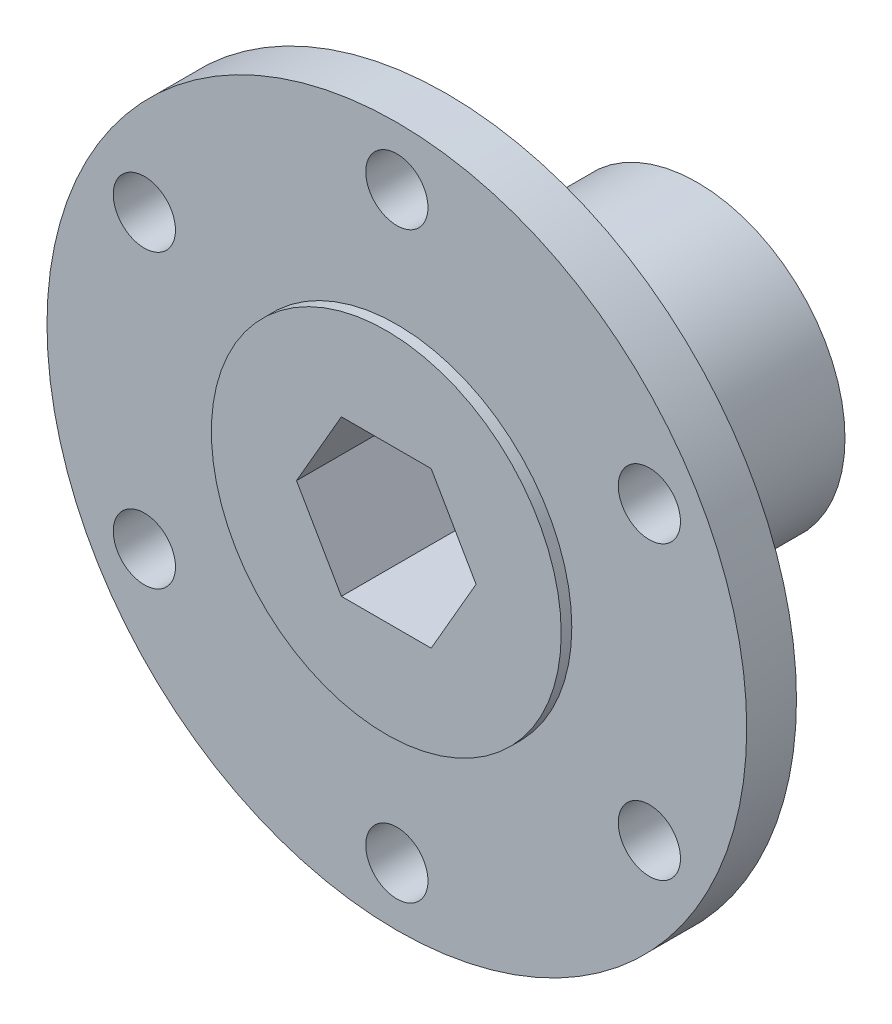
ISO-10303-21;
HEADER;
FILE_DESCRIPTION(('STEP AP214'),'2;1');
FILE_NAME('part.step','',(''),(''),'','','');
FILE_SCHEMA(('AUTOMOTIVE_DESIGN { 1 0 10303 214 1 1 1 1 }'));
ENDSEC;
DATA;
#1=APPLICATION_CONTEXT('core data for automotive mechanical design processes');
#2=APPLICATION_PROTOCOL_DEFINITION('international standard','automotive_design',2000,#1);
#3=PRODUCT_CONTEXT('',#1,'mechanical');
#4=PRODUCT('Part','Part','',(#3));
#5=PRODUCT_RELATED_PRODUCT_CATEGORY('part','',(#4));
#6=PRODUCT_DEFINITION_FORMATION('','',#4);
#7=PRODUCT_DEFINITION_CONTEXT('part definition',#1,'design');
#8=PRODUCT_DEFINITION('design','',#6,#7);
#9=PRODUCT_DEFINITION_SHAPE('','',#8);
#10=(LENGTH_UNIT() NAMED_UNIT(*) SI_UNIT(.MILLI.,.METRE.));
#11=(NAMED_UNIT(*) PLANE_ANGLE_UNIT() SI_UNIT($,.RADIAN.));
#12=(NAMED_UNIT(*) SI_UNIT($,.STERADIAN.) SOLID_ANGLE_UNIT());
#13=UNCERTAINTY_MEASURE_WITH_UNIT(LENGTH_MEASURE(1.E-05),#10,'distance_accuracy_value','');
#14=(GEOMETRIC_REPRESENTATION_CONTEXT(3) GLOBAL_UNCERTAINTY_ASSIGNED_CONTEXT((#13)) GLOBAL_UNIT_ASSIGNED_CONTEXT((#10,
#11,#12)) REPRESENTATION_CONTEXT('',''));
#15=CARTESIAN_POINT('',(0.,0.,0.));
#16=DIRECTION('',(0.,0.,1.));
#17=DIRECTION('',(1.,0.,0.));
#18=AXIS2_PLACEMENT_3D('',#15,#16,#17);
#19=CARTESIAN_POINT('',(0.,0.,0.));
#20=DIRECTION('',(0.,0.,1.));
#21=DIRECTION('',(1.,0.,0.));
#22=AXIS2_PLACEMENT_3D('',#19,#20,#21);
#23=PLANE('',#22);
#24=CARTESIAN_POINT('',(-20.6222299276163,11.9062499999988,0.));
#25=DIRECTION('',(0.,0.,1.));
#26=DIRECTION('',(1.,0.,0.));
#27=AXIS2_PLACEMENT_3D('',#24,#25,#26);
#28=CIRCLE('',#27,2.54000000000127);
#29=CARTESIAN_POINT('',(-18.082229927615,11.9062499999988,0.));
#30=VERTEX_POINT('',#29);
#31=EDGE_CURVE('E135',#30,#30,#28,.T.);
#32=ORIENTED_EDGE('',*,*,#31,.T.);
#33=EDGE_LOOP('',(#32));
#34=FACE_BOUND('',#33,.T.);
#35=CARTESIAN_POINT('',(-20.6222299276149,-11.9062500000012,0.));
#36=DIRECTION('',(0.,0.,1.));
#37=DIRECTION('',(1.,0.,0.));
#38=AXIS2_PLACEMENT_3D('',#35,#36,#37);
#39=CIRCLE('',#38,2.5400000000025);
#40=CARTESIAN_POINT('',(-18.0822299276124,-11.9062500000012,0.));
#41=VERTEX_POINT('',#40);
#42=EDGE_CURVE('E141',#41,#41,#39,.T.);
#43=ORIENTED_EDGE('',*,*,#42,.T.);
#44=EDGE_LOOP('',(#43));
#45=FACE_BOUND('',#44,.T.);
#46=CARTESIAN_POINT('',(2.70133544286504E-12,-23.8125,0.));
#47=DIRECTION('',(0.,0.,1.));
#48=DIRECTION('',(1.,0.,0.));
#49=AXIS2_PLACEMENT_3D('',#46,#47,#48);
#50=CIRCLE('',#49,2.54000000000274);
#51=CARTESIAN_POINT('',(2.54000000000544,-23.8125,0.));
#52=VERTEX_POINT('',#51);
#53=EDGE_CURVE('E147',#52,#52,#50,.T.);
#54=ORIENTED_EDGE('',*,*,#53,.T.);
#55=EDGE_LOOP('',(#54));
#56=FACE_BOUND('',#55,.T.);
#57=CARTESIAN_POINT('',(20.622229927619,-11.9062499999988,0.));
#58=DIRECTION('',(0.,0.,1.));
#59=DIRECTION('',(1.,0.,0.));
#60=AXIS2_PLACEMENT_3D('',#57,#58,#59);
#61=CIRCLE('',#60,2.5400000000017);
#62=CARTESIAN_POINT('',(23.1622299276207,-11.9062499999988,0.));
#63=VERTEX_POINT('',#62);
#64=EDGE_CURVE('E153',#63,#63,#61,.T.);
#65=ORIENTED_EDGE('',*,*,#64,.T.);
#66=EDGE_LOOP('',(#65));
#67=FACE_BOUND('',#66,.T.);
#68=CARTESIAN_POINT('',(20.6222299276176,11.9062500000012,0.));
#69=DIRECTION('',(0.,0.,1.));
#70=DIRECTION('',(1.,0.,0.));
#71=AXIS2_PLACEMENT_3D('',#68,#69,#70);
#72=CIRCLE('',#71,2.54000000000037);
#73=CARTESIAN_POINT('',(23.162229927618,11.9062500000012,0.));
#74=VERTEX_POINT('',#73);
#75=EDGE_CURVE('E159',#74,#74,#72,.T.);
#76=ORIENTED_EDGE('',*,*,#75,.T.);
#77=EDGE_LOOP('',(#76));
#78=FACE_BOUND('',#77,.T.);
#79=CARTESIAN_POINT('',(0.,0.,0.));
#80=DIRECTION('',(0.,0.,1.));
#81=DIRECTION('',(1.,0.,0.));
#82=AXIS2_PLACEMENT_3D('',#79,#80,#81);
#83=CIRCLE('',#82,28.575);
#84=CARTESIAN_POINT('',(28.575,0.,0.));
#85=VERTEX_POINT('',#84);
#86=EDGE_CURVE('E179',#85,#85,#83,.T.);
#87=ORIENTED_EDGE('',*,*,#86,.F.);
#88=EDGE_LOOP('',(#87));
#89=FACE_BOUND('',#88,.T.);
#90=CARTESIAN_POINT('',(0.,23.8125,0.));
#91=DIRECTION('',(0.,0.,1.));
#92=DIRECTION('',(1.,0.,0.));
#93=AXIS2_PLACEMENT_3D('',#90,#91,#92);
#94=CIRCLE('',#93,2.54);
#95=CARTESIAN_POINT('',(2.54,23.8125,0.));
#96=VERTEX_POINT('',#95);
#97=EDGE_CURVE('E175',#96,#96,#94,.T.);
#98=ORIENTED_EDGE('',*,*,#97,.T.);
#99=EDGE_LOOP('',(#98));
#100=FACE_BOUND('',#99,.T.);
#101=CARTESIAN_POINT('',(0.,0.,0.));
#102=DIRECTION('',(0.,0.,1.));
#103=DIRECTION('',(1.,0.,0.));
#104=AXIS2_PLACEMENT_3D('',#101,#102,#103);
#105=CIRCLE('',#104,12.065);
#106=CARTESIAN_POINT('',(12.065,0.,0.));
#107=VERTEX_POINT('',#106);
#108=EDGE_CURVE('E11',#107,#107,#105,.F.);
#109=ORIENTED_EDGE('',*,*,#108,.F.);
#110=EDGE_LOOP('',(#109));
#111=FACE_BOUND('',#110,.T.);
#112=ADVANCED_FACE('F32',(#34,#45,#56,#67,#78,#89,#100,#111),#23,.F.);
#113=CARTESIAN_POINT('',(0.,0.,4.064));
#114=DIRECTION('',(0.,0.,1.));
#115=DIRECTION('',(1.,0.,0.));
#116=AXIS2_PLACEMENT_3D('',#113,#114,#115);
#117=PLANE('',#116);
#118=CARTESIAN_POINT('',(0.,0.,4.064));
#119=DIRECTION('',(0.,0.,1.));
#120=DIRECTION('',(1.,0.,0.));
#121=AXIS2_PLACEMENT_3D('',#118,#119,#120);
#122=CIRCLE('',#121,14.2875);
#123=CARTESIAN_POINT('',(14.2875,0.,4.064));
#124=VERTEX_POINT('',#123);
#125=EDGE_CURVE('E116',#124,#124,#122,.T.);
#126=ORIENTED_EDGE('',*,*,#125,.F.);
#127=EDGE_LOOP('',(#126));
#128=FACE_BOUND('',#127,.T.);
#129=CARTESIAN_POINT('',(-20.6222299276149,-11.9062500000012,4.064));
#130=DIRECTION('',(0.,0.,1.));
#131=DIRECTION('',(1.,0.,0.));
#132=AXIS2_PLACEMENT_3D('',#129,#130,#131);
#133=CIRCLE('',#132,2.5400000000025);
#134=CARTESIAN_POINT('',(-18.0822299276124,-11.9062500000012,4.064));
#135=VERTEX_POINT('',#134);
#136=EDGE_CURVE('E144',#135,#135,#133,.T.);
#137=ORIENTED_EDGE('',*,*,#136,.F.);
#138=EDGE_LOOP('',(#137));
#139=FACE_BOUND('',#138,.T.);
#140=CARTESIAN_POINT('',(20.622229927619,-11.9062499999988,4.064));
#141=DIRECTION('',(0.,0.,1.));
#142=DIRECTION('',(1.,0.,0.));
#143=AXIS2_PLACEMENT_3D('',#140,#141,#142);
#144=CIRCLE('',#143,2.5400000000017);
#145=CARTESIAN_POINT('',(23.1622299276207,-11.9062499999988,4.064));
#146=VERTEX_POINT('',#145);
#147=EDGE_CURVE('E156',#146,#146,#144,.T.);
#148=ORIENTED_EDGE('',*,*,#147,.F.);
#149=EDGE_LOOP('',(#148));
#150=FACE_BOUND('',#149,.T.);
#151=CARTESIAN_POINT('',(0.,23.8125,4.064));
#152=DIRECTION('',(0.,0.,1.));
#153=DIRECTION('',(1.,0.,0.));
#154=AXIS2_PLACEMENT_3D('',#151,#152,#153);
#155=CIRCLE('',#154,2.54);
#156=CARTESIAN_POINT('',(2.54,23.8125,4.064));
#157=VERTEX_POINT('',#156);
#158=EDGE_CURVE('E176',#157,#157,#155,.T.);
#159=ORIENTED_EDGE('',*,*,#158,.F.);
#160=EDGE_LOOP('',(#159));
#161=FACE_BOUND('',#160,.T.);
#162=CARTESIAN_POINT('',(0.,0.,4.064));
#163=DIRECTION('',(0.,0.,1.));
#164=DIRECTION('',(1.,0.,0.));
#165=AXIS2_PLACEMENT_3D('',#162,#163,#164);
#166=CIRCLE('',#165,28.575);
#167=CARTESIAN_POINT('',(28.575,0.,4.064));
#168=VERTEX_POINT('',#167);
#169=EDGE_CURVE('E40',#168,#168,#166,.T.);
#170=ORIENTED_EDGE('',*,*,#169,.T.);
#171=EDGE_LOOP('',(#170));
#172=FACE_BOUND('',#171,.T.);
#173=CARTESIAN_POINT('',(20.6222299276176,11.9062500000012,4.064));
#174=DIRECTION('',(0.,0.,1.));
#175=DIRECTION('',(1.,0.,0.));
#176=AXIS2_PLACEMENT_3D('',#173,#174,#175);
#177=CIRCLE('',#176,2.54000000000037);
#178=CARTESIAN_POINT('',(23.162229927618,11.9062500000012,4.064));
#179=VERTEX_POINT('',#178);
#180=EDGE_CURVE('E162',#179,#179,#177,.T.);
#181=ORIENTED_EDGE('',*,*,#180,.F.);
#182=EDGE_LOOP('',(#181));
#183=FACE_BOUND('',#182,.T.);
#184=CARTESIAN_POINT('',(2.70133544286504E-12,-23.8125,4.064));
#185=DIRECTION('',(0.,0.,1.));
#186=DIRECTION('',(1.,0.,0.));
#187=AXIS2_PLACEMENT_3D('',#184,#185,#186);
#188=CIRCLE('',#187,2.54000000000274);
#189=CARTESIAN_POINT('',(2.54000000000544,-23.8125,4.064));
#190=VERTEX_POINT('',#189);
#191=EDGE_CURVE('E150',#190,#190,#188,.T.);
#192=ORIENTED_EDGE('',*,*,#191,.F.);
#193=EDGE_LOOP('',(#192));
#194=FACE_BOUND('',#193,.T.);
#195=CARTESIAN_POINT('',(-20.6222299276163,11.9062499999988,4.064));
#196=DIRECTION('',(0.,0.,1.));
#197=DIRECTION('',(1.,0.,0.));
#198=AXIS2_PLACEMENT_3D('',#195,#196,#197);
#199=CIRCLE('',#198,2.54000000000127);
#200=CARTESIAN_POINT('',(-18.082229927615,11.9062499999988,4.064));
#201=VERTEX_POINT('',#200);
#202=EDGE_CURVE('E138',#201,#201,#199,.T.);
#203=ORIENTED_EDGE('',*,*,#202,.F.);
#204=EDGE_LOOP('',(#203));
#205=FACE_BOUND('',#204,.T.);
#206=ADVANCED_FACE('F189',(#128,#139,#150,#161,#172,#183,#194,#205),#117,.T.);
#207=CARTESIAN_POINT('',(0.,0.,4.064));
#208=DIRECTION('',(0.,0.,-1.));
#209=DIRECTION('',(-1.,0.,0.));
#210=AXIS2_PLACEMENT_3D('',#207,#208,#209);
#211=CYLINDRICAL_SURFACE('',#210,28.575);
#212=ORIENTED_EDGE('',*,*,#169,.F.);
#213=EDGE_LOOP('',(#212));
#214=FACE_BOUND('',#213,.T.);
#215=ORIENTED_EDGE('',*,*,#86,.T.);
#216=EDGE_LOOP('',(#215));
#217=FACE_BOUND('',#216,.T.);
#218=ADVANCED_FACE('F34',(#214,#217),#211,.T.);
#219=CARTESIAN_POINT('',(0.,23.8125,4.064));
#220=DIRECTION('',(0.,0.,-1.));
#221=DIRECTION('',(-1.,0.,0.));
#222=AXIS2_PLACEMENT_3D('',#219,#220,#221);
#223=CYLINDRICAL_SURFACE('',#222,2.54);
#224=ORIENTED_EDGE('',*,*,#158,.T.);
#225=EDGE_LOOP('',(#224));
#226=FACE_BOUND('',#225,.T.);
#227=ORIENTED_EDGE('',*,*,#97,.F.);
#228=EDGE_LOOP('',(#227));
#229=FACE_BOUND('',#228,.T.);
#230=ADVANCED_FACE('F253',(#226,#229),#223,.F.);
#231=CARTESIAN_POINT('',(3.66617420935413,-6.35,4.064));
#232=DIRECTION('',(-0.866025403784439,0.5,0.));
#233=DIRECTION('',(-0.5,-0.866025403784439,0.));
#234=AXIS2_PLACEMENT_3D('',#231,#232,#233);
#235=PLANE('',#234);
#236=DIRECTION('',(0.,0.,-1.));
#237=VECTOR('',#236,1.);
#238=CARTESIAN_POINT('',(7.33234841870825,0.,4.064));
#239=LINE('',#238,#237);
#240=CARTESIAN_POINT('',(7.33234841870825,0.,4.9276));
#241=VERTEX_POINT('',#240);
#242=CARTESIAN_POINT('',(7.33234841870825,0.,-20.4724));
#243=VERTEX_POINT('',#242);
#244=EDGE_CURVE('E173',#241,#243,#239,.T.);
#245=ORIENTED_EDGE('',*,*,#244,.T.);
#246=DIRECTION('',(-0.500000000000007,-0.866025403784435,0.));
#247=VECTOR('',#246,1.);
#248=CARTESIAN_POINT('',(7.33234841870825,0.,-20.4724));
#249=LINE('',#248,#247);
#250=CARTESIAN_POINT('',(3.66617420935407,-6.35000000000004,-20.4724));
#251=VERTEX_POINT('',#250);
#252=EDGE_CURVE('E108',#243,#251,#249,.T.);
#253=ORIENTED_EDGE('',*,*,#252,.T.);
#254=DIRECTION('',(0.,0.,-1.));
#255=VECTOR('',#254,1.);
#256=CARTESIAN_POINT('',(3.66617420935413,-6.35,4.064));
#257=LINE('',#256,#255);
#258=CARTESIAN_POINT('',(3.66617420935413,-6.35,4.9276));
#259=VERTEX_POINT('',#258);
#260=EDGE_CURVE('E165',#259,#251,#257,.T.);
#261=ORIENTED_EDGE('',*,*,#260,.F.);
#262=DIRECTION('',(-0.5,-0.866025403784439,0.));
#263=VECTOR('',#262,1.);
#264=CARTESIAN_POINT('',(5.49926131403119,-3.175,4.9276));
#265=LINE('',#264,#263);
#266=EDGE_CURVE('E123',#241,#259,#265,.T.);
#267=ORIENTED_EDGE('',*,*,#266,.F.);
#268=EDGE_LOOP('',(#245,#253,#261,#267));
#269=FACE_BOUND('',#268,.T.);
#270=ADVANCED_FACE('F249',(#269),#235,.T.);
#271=CARTESIAN_POINT('',(7.33234841870825,0.,4.064));
#272=DIRECTION('',(-0.866025403784438,-0.5,0.));
#273=DIRECTION('',(0.5,-0.866025403784439,0.));
#274=AXIS2_PLACEMENT_3D('',#271,#272,#273);
#275=PLANE('',#274);
#276=DIRECTION('',(0.,0.,-1.));
#277=VECTOR('',#276,1.);
#278=CARTESIAN_POINT('',(3.66617420935412,6.35000000000001,4.064));
#279=LINE('',#278,#277);
#280=CARTESIAN_POINT('',(3.66617420935412,6.35000000000001,4.9276));
#281=VERTEX_POINT('',#280);
#282=CARTESIAN_POINT('',(3.66617420935415,6.34999999999999,-20.4724));
#283=VERTEX_POINT('',#282);
#284=EDGE_CURVE('E171',#281,#283,#279,.T.);
#285=ORIENTED_EDGE('',*,*,#284,.T.);
#286=DIRECTION('',(0.499999999999995,-0.866025403784441,0.));
#287=VECTOR('',#286,1.);
#288=CARTESIAN_POINT('',(3.66617420935415,6.34999999999999,-20.4724));
#289=LINE('',#288,#287);
#290=EDGE_CURVE('E103',#283,#243,#289,.T.);
#291=ORIENTED_EDGE('',*,*,#290,.T.);
#292=ORIENTED_EDGE('',*,*,#244,.F.);
#293=DIRECTION('',(0.5,-0.866025403784439,0.));
#294=VECTOR('',#293,1.);
#295=CARTESIAN_POINT('',(5.49926131403119,3.175,4.9276));
#296=LINE('',#295,#294);
#297=EDGE_CURVE('E120',#281,#241,#296,.T.);
#298=ORIENTED_EDGE('',*,*,#297,.F.);
#299=EDGE_LOOP('',(#285,#291,#292,#298));
#300=FACE_BOUND('',#299,.T.);
#301=ADVANCED_FACE('F245',(#300),#275,.T.);
#302=CARTESIAN_POINT('',(3.66617420935412,6.35000000000001,4.064));
#303=DIRECTION('',(0.,-1.,0.));
#304=DIRECTION('',(1.,0.,0.));
#305=AXIS2_PLACEMENT_3D('',#302,#303,#304);
#306=PLANE('',#305);
#307=DIRECTION('',(0.,0.,-1.));
#308=VECTOR('',#307,1.);
#309=CARTESIAN_POINT('',(-3.66617420935413,6.35000000000001,4.064));
#310=LINE('',#309,#308);
#311=CARTESIAN_POINT('',(-3.66617420935413,6.35000000000001,4.9276));
#312=VERTEX_POINT('',#311);
#313=CARTESIAN_POINT('',(-3.66617420935411,6.35000000000001,-20.4724));
#314=VERTEX_POINT('',#313);
#315=EDGE_CURVE('E47',#312,#314,#310,.T.);
#316=ORIENTED_EDGE('',*,*,#315,.T.);
#317=DIRECTION('',(1.,0.,0.));
#318=VECTOR('',#317,1.);
#319=CARTESIAN_POINT('',(-3.66617420935411,6.35000000000001,-20.4724));
#320=LINE('',#319,#318);
#321=EDGE_CURVE('E101',#314,#283,#320,.T.);
#322=ORIENTED_EDGE('',*,*,#321,.T.);
#323=ORIENTED_EDGE('',*,*,#284,.F.);
#324=DIRECTION('',(1.,0.,0.));
#325=VECTOR('',#324,1.);
#326=CARTESIAN_POINT('',(0.,6.35000000000001,4.9276));
#327=LINE('',#326,#325);
#328=EDGE_CURVE('E117',#312,#281,#327,.T.);
#329=ORIENTED_EDGE('',*,*,#328,.F.);
#330=EDGE_LOOP('',(#316,#322,#323,#329));
#331=FACE_BOUND('',#330,.T.);
#332=ADVANCED_FACE('F242',(#331),#306,.T.);
#333=CARTESIAN_POINT('',(-3.66617420935413,6.35000000000001,4.064));
#334=DIRECTION('',(0.866025403784439,-0.5,0.));
#335=DIRECTION('',(0.5,0.866025403784439,0.));
#336=AXIS2_PLACEMENT_3D('',#333,#334,#335);
#337=PLANE('',#336);
#338=DIRECTION('',(0.,0.,-1.));
#339=VECTOR('',#338,1.);
#340=CARTESIAN_POINT('',(-7.33234841870825,0.,4.064));
#341=LINE('',#340,#339);
#342=CARTESIAN_POINT('',(-7.33234841870825,0.,4.9276));
#343=VERTEX_POINT('',#342);
#344=CARTESIAN_POINT('',(-7.33234841870825,0.,-20.4724));
#345=VERTEX_POINT('',#344);
#346=EDGE_CURVE('E55',#343,#345,#341,.T.);
#347=ORIENTED_EDGE('',*,*,#346,.T.);
#348=DIRECTION('',(0.500000000000001,0.866025403784438,0.));
#349=VECTOR('',#348,1.);
#350=CARTESIAN_POINT('',(-7.33234841870825,0.,-20.4724));
#351=LINE('',#350,#349);
#352=EDGE_CURVE('E86',#345,#314,#351,.T.);
#353=ORIENTED_EDGE('',*,*,#352,.T.);
#354=ORIENTED_EDGE('',*,*,#315,.F.);
#355=DIRECTION('',(0.5,0.866025403784439,0.));
#356=VECTOR('',#355,1.);
#357=CARTESIAN_POINT('',(-5.49926131403119,3.175,4.9276));
#358=LINE('',#357,#356);
#359=EDGE_CURVE('E88',#343,#312,#358,.T.);
#360=ORIENTED_EDGE('',*,*,#359,.F.);
#361=EDGE_LOOP('',(#347,#353,#354,#360));
#362=FACE_BOUND('',#361,.T.);
#363=ADVANCED_FACE('F84',(#362),#337,.T.);
#364=CARTESIAN_POINT('',(-7.33234841870825,0.,4.064));
#365=DIRECTION('',(0.866025403784439,0.5,0.));
#366=DIRECTION('',(-0.5,0.866025403784439,0.));
#367=AXIS2_PLACEMENT_3D('',#364,#365,#366);
#368=PLANE('',#367);
#369=DIRECTION('',(0.,0.,-1.));
#370=VECTOR('',#369,1.);
#371=CARTESIAN_POINT('',(-3.66617420935413,-6.35,4.064));
#372=LINE('',#371,#370);
#373=CARTESIAN_POINT('',(-3.66617420935412,-6.35000000000001,4.9276));
#374=VERTEX_POINT('',#373);
#375=CARTESIAN_POINT('',(-3.6661742093542,-6.34999999999996,-20.4724));
#376=VERTEX_POINT('',#375);
#377=EDGE_CURVE('E89',#374,#376,#372,.T.);
#378=ORIENTED_EDGE('',*,*,#377,.T.);
#379=DIRECTION('',(-0.499999999999995,0.866025403784441,0.));
#380=VECTOR('',#379,1.);
#381=CARTESIAN_POINT('',(-3.6661742093542,-6.34999999999996,-20.4724));
#382=LINE('',#381,#380);
#383=EDGE_CURVE('E92',#376,#345,#382,.T.);
#384=ORIENTED_EDGE('',*,*,#383,.T.);
#385=ORIENTED_EDGE('',*,*,#346,.F.);
#386=DIRECTION('',(-0.5,0.866025403784439,0.));
#387=VECTOR('',#386,1.);
#388=CARTESIAN_POINT('',(-5.49926131403119,-3.175,4.9276));
#389=LINE('',#388,#387);
#390=EDGE_CURVE('E129',#374,#343,#389,.T.);
#391=ORIENTED_EDGE('',*,*,#390,.F.);
#392=EDGE_LOOP('',(#378,#384,#385,#391));
#393=FACE_BOUND('',#392,.T.);
#394=ADVANCED_FACE('F93',(#393),#368,.T.);
#395=CARTESIAN_POINT('',(-3.66617420935413,-6.35,4.064));
#396=DIRECTION('',(0.,1.,0.));
#397=DIRECTION('',(-1.,0.,0.));
#398=AXIS2_PLACEMENT_3D('',#395,#396,#397);
#399=PLANE('',#398);
#400=ORIENTED_EDGE('',*,*,#260,.T.);
#401=DIRECTION('',(-1.,0.,0.));
#402=VECTOR('',#401,1.);
#403=CARTESIAN_POINT('',(3.66617420935407,-6.35000000000004,-20.4724));
#404=LINE('',#403,#402);
#405=EDGE_CURVE('E111',#251,#376,#404,.T.);
#406=ORIENTED_EDGE('',*,*,#405,.T.);
#407=ORIENTED_EDGE('',*,*,#377,.F.);
#408=DIRECTION('',(-1.,0.,0.));
#409=VECTOR('',#408,1.);
#410=CARTESIAN_POINT('',(0.,-6.35,4.9276));
#411=LINE('',#410,#409);
#412=EDGE_CURVE('E126',#259,#374,#411,.T.);
#413=ORIENTED_EDGE('',*,*,#412,.F.);
#414=EDGE_LOOP('',(#400,#406,#407,#413));
#415=FACE_BOUND('',#414,.T.);
#416=ADVANCED_FACE('F233',(#415),#399,.T.);
#417=CARTESIAN_POINT('',(20.6222299276176,11.9062500000012,4.064));
#418=DIRECTION('',(0.,0.,-1.));
#419=DIRECTION('',(-1.,0.,0.));
#420=AXIS2_PLACEMENT_3D('',#417,#418,#419);
#421=CYLINDRICAL_SURFACE('',#420,2.54000000000037);
#422=ORIENTED_EDGE('',*,*,#180,.T.);
#423=EDGE_LOOP('',(#422));
#424=FACE_BOUND('',#423,.T.);
#425=ORIENTED_EDGE('',*,*,#75,.F.);
#426=EDGE_LOOP('',(#425));
#427=FACE_BOUND('',#426,.T.);
#428=ADVANCED_FACE('F229',(#424,#427),#421,.F.);
#429=CARTESIAN_POINT('',(20.622229927619,-11.9062499999988,4.064));
#430=DIRECTION('',(0.,0.,-1.));
#431=DIRECTION('',(-1.,0.,0.));
#432=AXIS2_PLACEMENT_3D('',#429,#430,#431);
#433=CYLINDRICAL_SURFACE('',#432,2.5400000000017);
#434=ORIENTED_EDGE('',*,*,#147,.T.);
#435=EDGE_LOOP('',(#434));
#436=FACE_BOUND('',#435,.T.);
#437=ORIENTED_EDGE('',*,*,#64,.F.);
#438=EDGE_LOOP('',(#437));
#439=FACE_BOUND('',#438,.T.);
#440=ADVANCED_FACE('F225',(#436,#439),#433,.F.);
#441=CARTESIAN_POINT('',(2.70133544286504E-12,-23.8125,4.064));
#442=DIRECTION('',(0.,0.,-1.));
#443=DIRECTION('',(-1.,0.,0.));
#444=AXIS2_PLACEMENT_3D('',#441,#442,#443);
#445=CYLINDRICAL_SURFACE('',#444,2.54000000000274);
#446=ORIENTED_EDGE('',*,*,#191,.T.);
#447=EDGE_LOOP('',(#446));
#448=FACE_BOUND('',#447,.T.);
#449=ORIENTED_EDGE('',*,*,#53,.F.);
#450=EDGE_LOOP('',(#449));
#451=FACE_BOUND('',#450,.T.);
#452=ADVANCED_FACE('F221',(#448,#451),#445,.F.);
#453=CARTESIAN_POINT('',(-20.6222299276149,-11.9062500000012,4.064));
#454=DIRECTION('',(0.,0.,-1.));
#455=DIRECTION('',(-1.,0.,0.));
#456=AXIS2_PLACEMENT_3D('',#453,#454,#455);
#457=CYLINDRICAL_SURFACE('',#456,2.5400000000025);
#458=ORIENTED_EDGE('',*,*,#136,.T.);
#459=EDGE_LOOP('',(#458));
#460=FACE_BOUND('',#459,.T.);
#461=ORIENTED_EDGE('',*,*,#42,.F.);
#462=EDGE_LOOP('',(#461));
#463=FACE_BOUND('',#462,.T.);
#464=ADVANCED_FACE('F217',(#460,#463),#457,.F.);
#465=CARTESIAN_POINT('',(-20.6222299276163,11.9062499999988,4.064));
#466=DIRECTION('',(0.,0.,-1.));
#467=DIRECTION('',(-1.,0.,0.));
#468=AXIS2_PLACEMENT_3D('',#465,#466,#467);
#469=CYLINDRICAL_SURFACE('',#468,2.54000000000127);
#470=ORIENTED_EDGE('',*,*,#202,.T.);
#471=EDGE_LOOP('',(#470));
#472=FACE_BOUND('',#471,.T.);
#473=ORIENTED_EDGE('',*,*,#31,.F.);
#474=EDGE_LOOP('',(#473));
#475=FACE_BOUND('',#474,.T.);
#476=ADVANCED_FACE('F213',(#472,#475),#469,.F.);
#477=CARTESIAN_POINT('',(0.,0.,4.9276));
#478=DIRECTION('',(0.,0.,-1.));
#479=DIRECTION('',(-1.,0.,0.));
#480=AXIS2_PLACEMENT_3D('',#477,#478,#479);
#481=CYLINDRICAL_SURFACE('',#480,14.2875);
#482=CARTESIAN_POINT('',(0.,0.,4.9276));
#483=DIRECTION('',(0.,0.,1.));
#484=DIRECTION('',(1.,0.,0.));
#485=AXIS2_PLACEMENT_3D('',#482,#483,#484);
#486=CIRCLE('',#485,14.2875);
#487=CARTESIAN_POINT('',(14.2875,0.,4.9276));
#488=VERTEX_POINT('',#487);
#489=EDGE_CURVE('E132',#488,#488,#486,.T.);
#490=ORIENTED_EDGE('',*,*,#489,.F.);
#491=EDGE_LOOP('',(#490));
#492=FACE_BOUND('',#491,.T.);
#493=ORIENTED_EDGE('',*,*,#125,.T.);
#494=EDGE_LOOP('',(#493));
#495=FACE_BOUND('',#494,.T.);
#496=ADVANCED_FACE('F209',(#492,#495),#481,.T.);
#497=CARTESIAN_POINT('',(0.,0.,4.9276));
#498=DIRECTION('',(0.,0.,1.));
#499=DIRECTION('',(1.,0.,0.));
#500=AXIS2_PLACEMENT_3D('',#497,#498,#499);
#501=PLANE('',#500);
#502=ORIENTED_EDGE('',*,*,#328,.T.);
#503=ORIENTED_EDGE('',*,*,#297,.T.);
#504=ORIENTED_EDGE('',*,*,#266,.T.);
#505=ORIENTED_EDGE('',*,*,#412,.T.);
#506=ORIENTED_EDGE('',*,*,#390,.T.);
#507=ORIENTED_EDGE('',*,*,#359,.T.);
#508=EDGE_LOOP('',(#502,#503,#504,#505,#506,#507));
#509=FACE_BOUND('',#508,.T.);
#510=ORIENTED_EDGE('',*,*,#489,.T.);
#511=EDGE_LOOP('',(#510));
#512=FACE_BOUND('',#511,.T.);
#513=ADVANCED_FACE('F202',(#509,#512),#501,.T.);
#514=CARTESIAN_POINT('',(0.,0.,-20.4724));
#515=DIRECTION('',(0.,0.,-1.));
#516=DIRECTION('',(-1.,0.,0.));
#517=AXIS2_PLACEMENT_3D('',#514,#515,#516);
#518=PLANE('',#517);
#519=CARTESIAN_POINT('',(0.,0.,-20.4724));
#520=DIRECTION('',(0.,0.,-1.));
#521=DIRECTION('',(-1.,0.,0.));
#522=AXIS2_PLACEMENT_3D('',#519,#520,#521);
#523=CIRCLE('',#522,12.065);
#524=CARTESIAN_POINT('',(-12.065,0.,-20.4724));
#525=VERTEX_POINT('',#524);
#526=EDGE_CURVE('E113',#525,#525,#523,.T.);
#527=ORIENTED_EDGE('',*,*,#526,.T.);
#528=EDGE_LOOP('',(#527));
#529=FACE_BOUND('',#528,.T.);
#530=ORIENTED_EDGE('',*,*,#352,.F.);
#531=ORIENTED_EDGE('',*,*,#383,.F.);
#532=ORIENTED_EDGE('',*,*,#405,.F.);
#533=ORIENTED_EDGE('',*,*,#252,.F.);
#534=ORIENTED_EDGE('',*,*,#290,.F.);
#535=ORIENTED_EDGE('',*,*,#321,.F.);
#536=EDGE_LOOP('',(#530,#531,#532,#533,#534,#535));
#537=FACE_BOUND('',#536,.T.);
#538=ADVANCED_FACE('F98',(#529,#537),#518,.T.);
#539=CARTESIAN_POINT('',(0.,0.,-20.4724));
#540=DIRECTION('',(0.,0.,1.));
#541=DIRECTION('',(1.,0.,0.));
#542=AXIS2_PLACEMENT_3D('',#539,#540,#541);
#543=CYLINDRICAL_SURFACE('',#542,12.065);
#544=ORIENTED_EDGE('',*,*,#526,.F.);
#545=EDGE_LOOP('',(#544));
#546=FACE_BOUND('',#545,.T.);
#547=ORIENTED_EDGE('',*,*,#108,.T.);
#548=EDGE_LOOP('',(#547));
#549=FACE_BOUND('',#548,.T.);
#550=ADVANCED_FACE('F195',(#546,#549),#543,.T.);
#551=CLOSED_SHELL('',(#112,#206,#218,#230,#270,#301,#332,#363,#394,#416,#428,#440,#452,#464,
#476,#496,#513,#538,#550));
#552=MANIFOLD_SOLID_BREP('B2',#551);
#553=ADVANCED_BREP_SHAPE_REPRESENTATION('',(#18,#552),#14);
#554=SHAPE_DEFINITION_REPRESENTATION(#9,#553);
ENDSEC;
END-ISO-10303-21;
